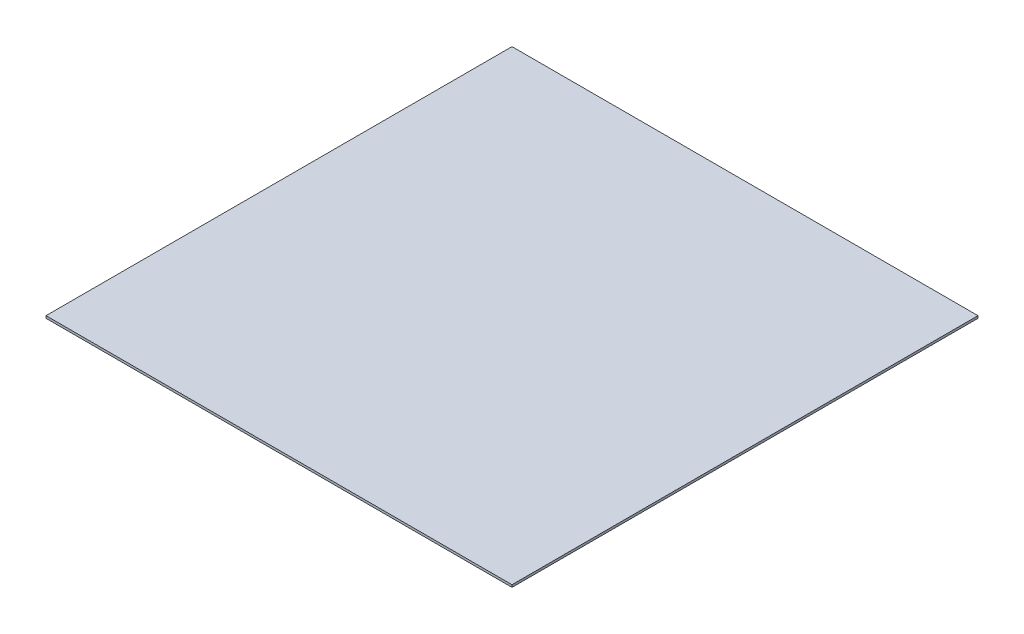
ISO-10303-21;
HEADER;
FILE_DESCRIPTION(('STEP AP214'),'2;1');
FILE_NAME('part.step','',(''),(''),'','','');
FILE_SCHEMA(('AUTOMOTIVE_DESIGN { 1 0 10303 214 1 1 1 1 }'));
ENDSEC;
DATA;
#1=APPLICATION_CONTEXT('core data for automotive mechanical design processes');
#2=APPLICATION_PROTOCOL_DEFINITION('international standard','automotive_design',2000,#1);
#3=PRODUCT_CONTEXT('',#1,'mechanical');
#4=PRODUCT('Part','Part','',(#3));
#5=PRODUCT_RELATED_PRODUCT_CATEGORY('part','',(#4));
#6=PRODUCT_DEFINITION_FORMATION('','',#4);
#7=PRODUCT_DEFINITION_CONTEXT('part definition',#1,'design');
#8=PRODUCT_DEFINITION('design','',#6,#7);
#9=PRODUCT_DEFINITION_SHAPE('','',#8);
#10=(LENGTH_UNIT() NAMED_UNIT(*) SI_UNIT(.MILLI.,.METRE.));
#11=(NAMED_UNIT(*) PLANE_ANGLE_UNIT() SI_UNIT($,.RADIAN.));
#12=(NAMED_UNIT(*) SI_UNIT($,.STERADIAN.) SOLID_ANGLE_UNIT());
#13=UNCERTAINTY_MEASURE_WITH_UNIT(LENGTH_MEASURE(1.E-05),#10,'distance_accuracy_value','');
#14=(GEOMETRIC_REPRESENTATION_CONTEXT(3) GLOBAL_UNCERTAINTY_ASSIGNED_CONTEXT((#13)) GLOBAL_UNIT_ASSIGNED_CONTEXT((#10,
#11,#12)) REPRESENTATION_CONTEXT('',''));
#15=CARTESIAN_POINT('',(0.,0.,0.));
#16=DIRECTION('',(0.,0.,1.));
#17=DIRECTION('',(1.,0.,0.));
#18=AXIS2_PLACEMENT_3D('',#15,#16,#17);
#19=CARTESIAN_POINT('',(0.,0.,-320.));
#20=DIRECTION('',(-1.,0.,0.));
#21=DIRECTION('',(0.,0.,1.));
#22=AXIS2_PLACEMENT_3D('',#19,#20,#21);
#23=PLANE('',#22);
#24=DIRECTION('',(0.,-1.,0.));
#25=VECTOR('',#24,1.);
#26=CARTESIAN_POINT('',(0.,0.,0.));
#27=LINE('',#26,#25);
#28=CARTESIAN_POINT('',(0.,1.6,0.));
#29=VERTEX_POINT('',#28);
#30=CARTESIAN_POINT('',(0.,0.,0.));
#31=VERTEX_POINT('',#30);
#32=EDGE_CURVE('E103',#29,#31,#27,.T.);
#33=ORIENTED_EDGE('',*,*,#32,.F.);
#34=DIRECTION('',(0.,0.,1.));
#35=VECTOR('',#34,1.);
#36=CARTESIAN_POINT('',(0.,1.6,-320.));
#37=LINE('',#36,#35);
#38=CARTESIAN_POINT('',(0.,1.6,-320.));
#39=VERTEX_POINT('',#38);
#40=EDGE_CURVE('E11',#39,#29,#37,.T.);
#41=ORIENTED_EDGE('',*,*,#40,.F.);
#42=DIRECTION('',(0.,-1.,0.));
#43=VECTOR('',#42,1.);
#44=CARTESIAN_POINT('',(0.,0.,-320.));
#45=LINE('',#44,#43);
#46=CARTESIAN_POINT('',(0.,0.,-320.));
#47=VERTEX_POINT('',#46);
#48=EDGE_CURVE('E97',#39,#47,#45,.T.);
#49=ORIENTED_EDGE('',*,*,#48,.T.);
#50=DIRECTION('',(0.,0.,1.));
#51=VECTOR('',#50,1.);
#52=CARTESIAN_POINT('',(0.,0.,-320.));
#53=LINE('',#52,#51);
#54=EDGE_CURVE('E42',#47,#31,#53,.T.);
#55=ORIENTED_EDGE('',*,*,#54,.T.);
#56=EDGE_LOOP('',(#33,#41,#49,#55));
#57=FACE_BOUND('',#56,.T.);
#58=ADVANCED_FACE('F39',(#57),#23,.T.);
#59=CARTESIAN_POINT('',(0.,1.6,-320.));
#60=DIRECTION('',(0.,1.,0.));
#61=DIRECTION('',(0.,0.,1.));
#62=AXIS2_PLACEMENT_3D('',#59,#60,#61);
#63=PLANE('',#62);
#64=DIRECTION('',(-1.,0.,0.));
#65=VECTOR('',#64,1.);
#66=CARTESIAN_POINT('',(0.,1.6,0.));
#67=LINE('',#66,#65);
#68=CARTESIAN_POINT('',(320.,1.6,0.));
#69=VERTEX_POINT('',#68);
#70=EDGE_CURVE('E99',#69,#29,#67,.T.);
#71=ORIENTED_EDGE('',*,*,#70,.F.);
#72=DIRECTION('',(0.,0.,1.));
#73=VECTOR('',#72,1.);
#74=CARTESIAN_POINT('',(320.,1.6,-320.));
#75=LINE('',#74,#73);
#76=CARTESIAN_POINT('',(320.,1.6,-320.));
#77=VERTEX_POINT('',#76);
#78=EDGE_CURVE('E48',#77,#69,#75,.T.);
#79=ORIENTED_EDGE('',*,*,#78,.F.);
#80=DIRECTION('',(-1.,0.,0.));
#81=VECTOR('',#80,1.);
#82=CARTESIAN_POINT('',(0.,1.6,-320.));
#83=LINE('',#82,#81);
#84=EDGE_CURVE('E94',#77,#39,#83,.T.);
#85=ORIENTED_EDGE('',*,*,#84,.T.);
#86=ORIENTED_EDGE('',*,*,#40,.T.);
#87=EDGE_LOOP('',(#71,#79,#85,#86));
#88=FACE_BOUND('',#87,.T.);
#89=ADVANCED_FACE('F113',(#88),#63,.T.);
#90=CARTESIAN_POINT('',(320.,0.,-320.));
#91=DIRECTION('',(1.,0.,0.));
#92=DIRECTION('',(0.,0.,-1.));
#93=AXIS2_PLACEMENT_3D('',#90,#91,#92);
#94=PLANE('',#93);
#95=DIRECTION('',(0.,1.,0.));
#96=VECTOR('',#95,1.);
#97=CARTESIAN_POINT('',(320.,0.,0.));
#98=LINE('',#97,#96);
#99=CARTESIAN_POINT('',(320.,0.,0.));
#100=VERTEX_POINT('',#99);
#101=EDGE_CURVE('E89',#100,#69,#98,.T.);
#102=ORIENTED_EDGE('',*,*,#101,.F.);
#103=DIRECTION('',(0.,0.,1.));
#104=VECTOR('',#103,1.);
#105=CARTESIAN_POINT('',(320.,0.,-320.));
#106=LINE('',#105,#104);
#107=CARTESIAN_POINT('',(320.,0.,-320.));
#108=VERTEX_POINT('',#107);
#109=EDGE_CURVE('E84',#108,#100,#106,.T.);
#110=ORIENTED_EDGE('',*,*,#109,.F.);
#111=DIRECTION('',(0.,1.,0.));
#112=VECTOR('',#111,1.);
#113=CARTESIAN_POINT('',(320.,0.,-320.));
#114=LINE('',#113,#112);
#115=EDGE_CURVE('E87',#108,#77,#114,.T.);
#116=ORIENTED_EDGE('',*,*,#115,.T.);
#117=ORIENTED_EDGE('',*,*,#78,.T.);
#118=EDGE_LOOP('',(#102,#110,#116,#117));
#119=FACE_BOUND('',#118,.T.);
#120=ADVANCED_FACE('F86',(#119),#94,.T.);
#121=CARTESIAN_POINT('',(0.,0.,-320.));
#122=DIRECTION('',(0.,-1.,0.));
#123=DIRECTION('',(0.,0.,-1.));
#124=AXIS2_PLACEMENT_3D('',#121,#122,#123);
#125=PLANE('',#124);
#126=DIRECTION('',(1.,0.,0.));
#127=VECTOR('',#126,1.);
#128=CARTESIAN_POINT('',(0.,0.,0.));
#129=LINE('',#128,#127);
#130=EDGE_CURVE('E106',#31,#100,#129,.T.);
#131=ORIENTED_EDGE('',*,*,#130,.F.);
#132=ORIENTED_EDGE('',*,*,#54,.F.);
#133=DIRECTION('',(1.,0.,0.));
#134=VECTOR('',#133,1.);
#135=CARTESIAN_POINT('',(0.,0.,-320.));
#136=LINE('',#135,#134);
#137=EDGE_CURVE('E93',#47,#108,#136,.T.);
#138=ORIENTED_EDGE('',*,*,#137,.T.);
#139=ORIENTED_EDGE('',*,*,#109,.T.);
#140=EDGE_LOOP('',(#131,#132,#138,#139));
#141=FACE_BOUND('',#140,.T.);
#142=ADVANCED_FACE('F96',(#141),#125,.T.);
#143=CARTESIAN_POINT('',(0.,0.,-320.));
#144=DIRECTION('',(0.,0.,-1.));
#145=DIRECTION('',(-1.,0.,0.));
#146=AXIS2_PLACEMENT_3D('',#143,#144,#145);
#147=PLANE('',#146);
#148=ORIENTED_EDGE('',*,*,#48,.F.);
#149=ORIENTED_EDGE('',*,*,#84,.F.);
#150=ORIENTED_EDGE('',*,*,#115,.F.);
#151=ORIENTED_EDGE('',*,*,#137,.F.);
#152=EDGE_LOOP('',(#148,#149,#150,#151));
#153=FACE_BOUND('',#152,.T.);
#154=ADVANCED_FACE('F92',(#153),#147,.T.);
#155=CARTESIAN_POINT('',(0.,0.,0.));
#156=DIRECTION('',(0.,0.,-1.));
#157=DIRECTION('',(-1.,0.,0.));
#158=AXIS2_PLACEMENT_3D('',#155,#156,#157);
#159=PLANE('',#158);
#160=ORIENTED_EDGE('',*,*,#32,.T.);
#161=ORIENTED_EDGE('',*,*,#130,.T.);
#162=ORIENTED_EDGE('',*,*,#101,.T.);
#163=ORIENTED_EDGE('',*,*,#70,.T.);
#164=EDGE_LOOP('',(#160,#161,#162,#163));
#165=FACE_BOUND('',#164,.T.);
#166=ADVANCED_FACE('F112',(#165),#159,.F.);
#167=CLOSED_SHELL('',(#58,#89,#120,#142,#154,#166));
#168=MANIFOLD_SOLID_BREP('B2',#167);
#169=ADVANCED_BREP_SHAPE_REPRESENTATION('',(#18,#168),#14);
#170=SHAPE_DEFINITION_REPRESENTATION(#9,#169);
ENDSEC;
END-ISO-10303-21;
